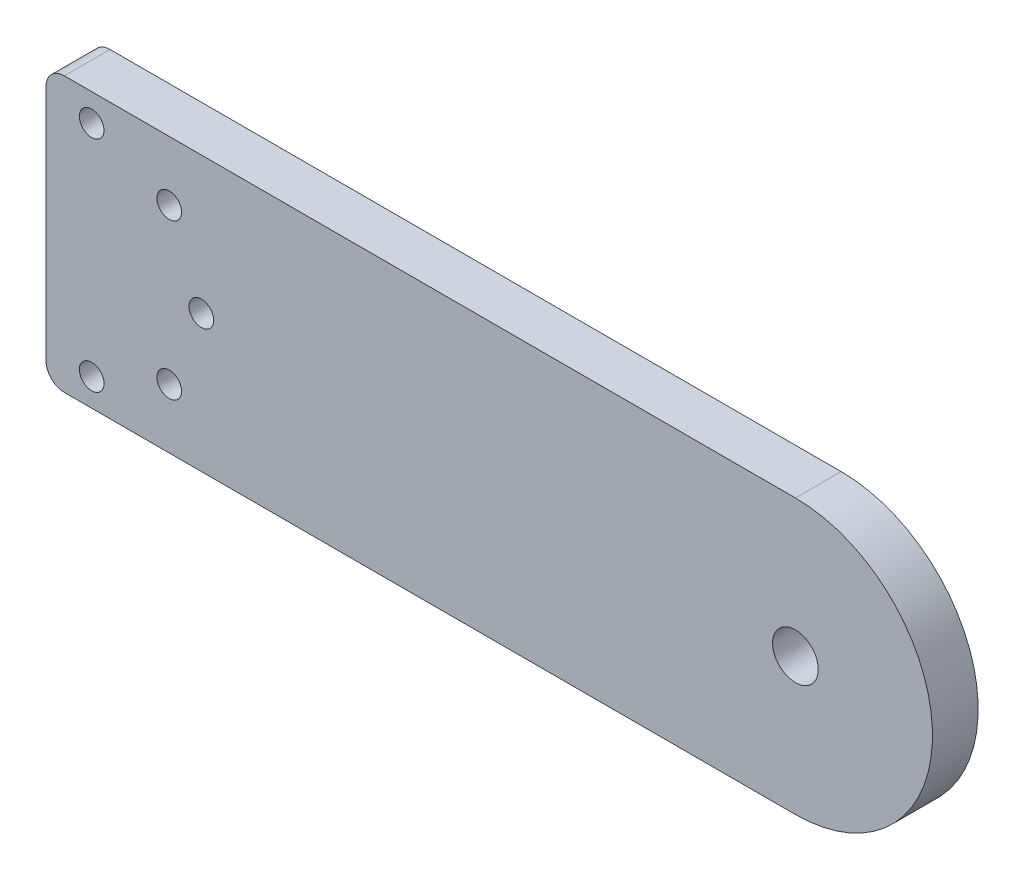
ISO-10303-21;
HEADER;
FILE_DESCRIPTION(('STEP AP214'),'2;1');
FILE_NAME('part.step','',(''),(''),'','','');
FILE_SCHEMA(('AUTOMOTIVE_DESIGN { 1 0 10303 214 1 1 1 1 }'));
ENDSEC;
DATA;
#1=APPLICATION_CONTEXT('core data for automotive mechanical design processes');
#2=APPLICATION_PROTOCOL_DEFINITION('international standard','automotive_design',2000,#1);
#3=PRODUCT_CONTEXT('',#1,'mechanical');
#4=PRODUCT('Part','Part','',(#3));
#5=PRODUCT_RELATED_PRODUCT_CATEGORY('part','',(#4));
#6=PRODUCT_DEFINITION_FORMATION('','',#4);
#7=PRODUCT_DEFINITION_CONTEXT('part definition',#1,'design');
#8=PRODUCT_DEFINITION('design','',#6,#7);
#9=PRODUCT_DEFINITION_SHAPE('','',#8);
#10=(LENGTH_UNIT() NAMED_UNIT(*) SI_UNIT(.MILLI.,.METRE.));
#11=(NAMED_UNIT(*) PLANE_ANGLE_UNIT() SI_UNIT($,.RADIAN.));
#12=(NAMED_UNIT(*) SI_UNIT($,.STERADIAN.) SOLID_ANGLE_UNIT());
#13=UNCERTAINTY_MEASURE_WITH_UNIT(LENGTH_MEASURE(1.E-05),#10,'distance_accuracy_value','');
#14=(GEOMETRIC_REPRESENTATION_CONTEXT(3) GLOBAL_UNCERTAINTY_ASSIGNED_CONTEXT((#13)) GLOBAL_UNIT_ASSIGNED_CONTEXT((#10,
#11,#12)) REPRESENTATION_CONTEXT('',''));
#15=CARTESIAN_POINT('',(0.,0.,0.));
#16=DIRECTION('',(0.,0.,1.));
#17=DIRECTION('',(1.,0.,0.));
#18=AXIS2_PLACEMENT_3D('',#15,#16,#17);
#19=CARTESIAN_POINT('',(-38.,-13.,5.));
#20=DIRECTION('',(0.,0.,1.));
#21=DIRECTION('',(1.,0.,0.));
#22=AXIS2_PLACEMENT_3D('',#19,#20,#21);
#23=PLANE('',#22);
#24=CARTESIAN_POINT('',(-23.,0.,5.));
#25=DIRECTION('',(0.,0.,1.));
#26=DIRECTION('',(1.,0.,0.));
#27=AXIS2_PLACEMENT_3D('',#24,#25,#26);
#28=CIRCLE('',#27,1.35);
#29=CARTESIAN_POINT('',(-21.65,0.,5.));
#30=VERTEX_POINT('',#29);
#31=EDGE_CURVE('E205',#30,#30,#28,.T.);
#32=ORIENTED_EDGE('',*,*,#31,.F.);
#33=EDGE_LOOP('',(#32));
#34=FACE_BOUND('',#33,.T.);
#35=CARTESIAN_POINT('',(-35.,12.,5.));
#36=DIRECTION('',(0.,0.,1.));
#37=DIRECTION('',(1.,0.,0.));
#38=AXIS2_PLACEMENT_3D('',#35,#36,#37);
#39=CIRCLE('',#38,1.35);
#40=CARTESIAN_POINT('',(-33.65,12.,5.));
#41=VERTEX_POINT('',#40);
#42=EDGE_CURVE('E217',#41,#41,#39,.T.);
#43=ORIENTED_EDGE('',*,*,#42,.F.);
#44=EDGE_LOOP('',(#43));
#45=FACE_BOUND('',#44,.T.);
#46=CARTESIAN_POINT('',(-35.,-12.,5.));
#47=DIRECTION('',(0.,0.,1.));
#48=DIRECTION('',(1.,0.,0.));
#49=AXIS2_PLACEMENT_3D('',#46,#47,#48);
#50=CIRCLE('',#49,1.35);
#51=CARTESIAN_POINT('',(-33.65,-12.,5.));
#52=VERTEX_POINT('',#51);
#53=EDGE_CURVE('E130',#52,#52,#50,.T.);
#54=ORIENTED_EDGE('',*,*,#53,.F.);
#55=EDGE_LOOP('',(#54));
#56=FACE_BOUND('',#55,.T.);
#57=CARTESIAN_POINT('',(-38.,-13.,5.));
#58=DIRECTION('',(0.,0.,1.));
#59=DIRECTION('',(1.,0.,0.));
#60=AXIS2_PLACEMENT_3D('',#57,#58,#59);
#61=CIRCLE('',#60,2.);
#62=CARTESIAN_POINT('',(-40.,-13.,5.));
#63=VERTEX_POINT('',#62);
#64=CARTESIAN_POINT('',(-38.,-15.,5.));
#65=VERTEX_POINT('',#64);
#66=EDGE_CURVE('E137',#63,#65,#61,.T.);
#67=ORIENTED_EDGE('',*,*,#66,.T.);
#68=DIRECTION('',(1.,0.,0.));
#69=VECTOR('',#68,1.);
#70=CARTESIAN_POINT('',(42.,-15.,5.));
#71=LINE('',#70,#69);
#72=CARTESIAN_POINT('',(42.,-15.,5.));
#73=VERTEX_POINT('',#72);
#74=EDGE_CURVE('E95',#65,#73,#71,.T.);
#75=ORIENTED_EDGE('',*,*,#74,.T.);
#76=CARTESIAN_POINT('',(42.,0.,5.));
#77=DIRECTION('',(0.,0.,1.));
#78=DIRECTION('',(-1.,0.,0.));
#79=AXIS2_PLACEMENT_3D('',#76,#77,#78);
#80=CIRCLE('',#79,15.);
#81=CARTESIAN_POINT('',(42.,15.,5.));
#82=VERTEX_POINT('',#81);
#83=EDGE_CURVE('E108',#73,#82,#80,.T.);
#84=ORIENTED_EDGE('',*,*,#83,.T.);
#85=DIRECTION('',(-1.,0.,0.));
#86=VECTOR('',#85,1.);
#87=CARTESIAN_POINT('',(42.,15.,5.));
#88=LINE('',#87,#86);
#89=CARTESIAN_POINT('',(-38.,15.,5.));
#90=VERTEX_POINT('',#89);
#91=EDGE_CURVE('E102',#82,#90,#88,.T.);
#92=ORIENTED_EDGE('',*,*,#91,.T.);
#93=CARTESIAN_POINT('',(-38.,13.,5.));
#94=DIRECTION('',(0.,0.,1.));
#95=DIRECTION('',(1.,0.,0.));
#96=AXIS2_PLACEMENT_3D('',#93,#94,#95);
#97=CIRCLE('',#96,2.00000000000001);
#98=CARTESIAN_POINT('',(-40.,13.,5.));
#99=VERTEX_POINT('',#98);
#100=EDGE_CURVE('E106',#90,#99,#97,.T.);
#101=ORIENTED_EDGE('',*,*,#100,.T.);
#102=DIRECTION('',(0.,-1.,0.));
#103=VECTOR('',#102,1.);
#104=CARTESIAN_POINT('',(-40.,13.,5.));
#105=LINE('',#104,#103);
#106=EDGE_CURVE('E58',#99,#63,#105,.T.);
#107=ORIENTED_EDGE('',*,*,#106,.T.);
#108=EDGE_LOOP('',(#67,#75,#84,#92,#101,#107));
#109=FACE_BOUND('',#108,.T.);
#110=CARTESIAN_POINT('',(-26.5147186257614,-8.48528137423857,5.));
#111=DIRECTION('',(0.,0.,1.));
#112=DIRECTION('',(1.,0.,0.));
#113=AXIS2_PLACEMENT_3D('',#110,#111,#112);
#114=CIRCLE('',#113,1.35);
#115=CARTESIAN_POINT('',(-25.1647186257614,-8.48528137423857,5.));
#116=VERTEX_POINT('',#115);
#117=EDGE_CURVE('E223',#116,#116,#114,.T.);
#118=ORIENTED_EDGE('',*,*,#117,.F.);
#119=EDGE_LOOP('',(#118));
#120=FACE_BOUND('',#119,.T.);
#121=CARTESIAN_POINT('',(-26.5147186257614,8.48528137423858,5.));
#122=DIRECTION('',(0.,0.,1.));
#123=DIRECTION('',(1.,0.,0.));
#124=AXIS2_PLACEMENT_3D('',#121,#122,#123);
#125=CIRCLE('',#124,1.35);
#126=CARTESIAN_POINT('',(-25.1647186257614,8.48528137423858,5.));
#127=VERTEX_POINT('',#126);
#128=EDGE_CURVE('E211',#127,#127,#125,.T.);
#129=ORIENTED_EDGE('',*,*,#128,.F.);
#130=EDGE_LOOP('',(#129));
#131=FACE_BOUND('',#130,.T.);
#132=CARTESIAN_POINT('',(42.,0.,5.));
#133=DIRECTION('',(0.,0.,1.));
#134=DIRECTION('',(1.,0.,0.));
#135=AXIS2_PLACEMENT_3D('',#132,#133,#134);
#136=CIRCLE('',#135,2.5);
#137=CARTESIAN_POINT('',(44.5,0.,5.));
#138=VERTEX_POINT('',#137);
#139=EDGE_CURVE('E196',#138,#138,#136,.T.);
#140=ORIENTED_EDGE('',*,*,#139,.F.);
#141=EDGE_LOOP('',(#140));
#142=FACE_BOUND('',#141,.T.);
#143=ADVANCED_FACE('F41',(#34,#45,#56,#109,#120,#131,#142),#23,.T.);
#144=CARTESIAN_POINT('',(-38.,-13.,0.));
#145=DIRECTION('',(0.,0.,1.));
#146=DIRECTION('',(1.,0.,0.));
#147=AXIS2_PLACEMENT_3D('',#144,#145,#146);
#148=PLANE('',#147);
#149=CARTESIAN_POINT('',(-38.,-13.,0.));
#150=DIRECTION('',(0.,0.,1.));
#151=DIRECTION('',(1.,0.,0.));
#152=AXIS2_PLACEMENT_3D('',#149,#150,#151);
#153=CIRCLE('',#152,2.);
#154=CARTESIAN_POINT('',(-40.,-13.,0.));
#155=VERTEX_POINT('',#154);
#156=CARTESIAN_POINT('',(-38.,-15.,0.));
#157=VERTEX_POINT('',#156);
#158=EDGE_CURVE('E126',#155,#157,#153,.T.);
#159=ORIENTED_EDGE('',*,*,#158,.F.);
#160=DIRECTION('',(0.,-1.,0.));
#161=VECTOR('',#160,1.);
#162=CARTESIAN_POINT('',(-40.,13.,0.));
#163=LINE('',#162,#161);
#164=CARTESIAN_POINT('',(-40.,13.,0.));
#165=VERTEX_POINT('',#164);
#166=EDGE_CURVE('E87',#165,#155,#163,.T.);
#167=ORIENTED_EDGE('',*,*,#166,.F.);
#168=CARTESIAN_POINT('',(-38.,13.,0.));
#169=DIRECTION('',(0.,0.,1.));
#170=DIRECTION('',(1.,0.,0.));
#171=AXIS2_PLACEMENT_3D('',#168,#169,#170);
#172=CIRCLE('',#171,2.00000000000001);
#173=CARTESIAN_POINT('',(-38.,15.,0.));
#174=VERTEX_POINT('',#173);
#175=EDGE_CURVE('E81',#174,#165,#172,.T.);
#176=ORIENTED_EDGE('',*,*,#175,.F.);
#177=DIRECTION('',(-1.,0.,0.));
#178=VECTOR('',#177,1.);
#179=CARTESIAN_POINT('',(42.,15.,0.));
#180=LINE('',#179,#178);
#181=CARTESIAN_POINT('',(42.,15.,0.));
#182=VERTEX_POINT('',#181);
#183=EDGE_CURVE('E116',#182,#174,#180,.T.);
#184=ORIENTED_EDGE('',*,*,#183,.F.);
#185=CARTESIAN_POINT('',(42.,0.,0.));
#186=DIRECTION('',(0.,0.,1.));
#187=DIRECTION('',(-1.,0.,0.));
#188=AXIS2_PLACEMENT_3D('',#185,#186,#187);
#189=CIRCLE('',#188,15.);
#190=CARTESIAN_POINT('',(42.,-15.,0.));
#191=VERTEX_POINT('',#190);
#192=EDGE_CURVE('E132',#191,#182,#189,.T.);
#193=ORIENTED_EDGE('',*,*,#192,.F.);
#194=DIRECTION('',(1.,0.,0.));
#195=VECTOR('',#194,1.);
#196=CARTESIAN_POINT('',(42.,-15.,0.));
#197=LINE('',#196,#195);
#198=EDGE_CURVE('E129',#157,#191,#197,.T.);
#199=ORIENTED_EDGE('',*,*,#198,.F.);
#200=EDGE_LOOP('',(#159,#167,#176,#184,#193,#199));
#201=FACE_BOUND('',#200,.T.);
#202=CARTESIAN_POINT('',(-35.,-12.,0.));
#203=DIRECTION('',(0.,0.,1.));
#204=DIRECTION('',(1.,0.,0.));
#205=AXIS2_PLACEMENT_3D('',#202,#203,#204);
#206=CIRCLE('',#205,1.35);
#207=CARTESIAN_POINT('',(-33.65,-12.,0.));
#208=VERTEX_POINT('',#207);
#209=EDGE_CURVE('E226',#208,#208,#206,.T.);
#210=ORIENTED_EDGE('',*,*,#209,.T.);
#211=EDGE_LOOP('',(#210));
#212=FACE_BOUND('',#211,.T.);
#213=CARTESIAN_POINT('',(-26.5147186257614,-8.48528137423857,0.));
#214=DIRECTION('',(0.,0.,1.));
#215=DIRECTION('',(1.,0.,0.));
#216=AXIS2_PLACEMENT_3D('',#213,#214,#215);
#217=CIRCLE('',#216,1.35);
#218=CARTESIAN_POINT('',(-25.1647186257614,-8.48528137423857,0.));
#219=VERTEX_POINT('',#218);
#220=EDGE_CURVE('E220',#219,#219,#217,.T.);
#221=ORIENTED_EDGE('',*,*,#220,.T.);
#222=EDGE_LOOP('',(#221));
#223=FACE_BOUND('',#222,.T.);
#224=CARTESIAN_POINT('',(-35.,12.,0.));
#225=DIRECTION('',(0.,0.,1.));
#226=DIRECTION('',(1.,0.,0.));
#227=AXIS2_PLACEMENT_3D('',#224,#225,#226);
#228=CIRCLE('',#227,1.35);
#229=CARTESIAN_POINT('',(-33.65,12.,0.));
#230=VERTEX_POINT('',#229);
#231=EDGE_CURVE('E214',#230,#230,#228,.T.);
#232=ORIENTED_EDGE('',*,*,#231,.T.);
#233=EDGE_LOOP('',(#232));
#234=FACE_BOUND('',#233,.T.);
#235=CARTESIAN_POINT('',(-26.5147186257614,8.48528137423858,0.));
#236=DIRECTION('',(0.,0.,1.));
#237=DIRECTION('',(1.,0.,0.));
#238=AXIS2_PLACEMENT_3D('',#235,#236,#237);
#239=CIRCLE('',#238,1.35);
#240=CARTESIAN_POINT('',(-25.1647186257614,8.48528137423858,0.));
#241=VERTEX_POINT('',#240);
#242=EDGE_CURVE('E208',#241,#241,#239,.T.);
#243=ORIENTED_EDGE('',*,*,#242,.T.);
#244=EDGE_LOOP('',(#243));
#245=FACE_BOUND('',#244,.T.);
#246=CARTESIAN_POINT('',(-23.,0.,0.));
#247=DIRECTION('',(0.,0.,1.));
#248=DIRECTION('',(1.,0.,0.));
#249=AXIS2_PLACEMENT_3D('',#246,#247,#248);
#250=CIRCLE('',#249,1.35);
#251=CARTESIAN_POINT('',(-21.65,0.,0.));
#252=VERTEX_POINT('',#251);
#253=EDGE_CURVE('E202',#252,#252,#250,.T.);
#254=ORIENTED_EDGE('',*,*,#253,.T.);
#255=EDGE_LOOP('',(#254));
#256=FACE_BOUND('',#255,.T.);
#257=CARTESIAN_POINT('',(42.,0.,0.));
#258=DIRECTION('',(0.,0.,1.));
#259=DIRECTION('',(1.,0.,0.));
#260=AXIS2_PLACEMENT_3D('',#257,#258,#259);
#261=CIRCLE('',#260,2.5);
#262=CARTESIAN_POINT('',(44.5,0.,0.));
#263=VERTEX_POINT('',#262);
#264=EDGE_CURVE('E199',#263,#263,#261,.T.);
#265=ORIENTED_EDGE('',*,*,#264,.T.);
#266=EDGE_LOOP('',(#265));
#267=FACE_BOUND('',#266,.T.);
#268=ADVANCED_FACE('F146',(#201,#212,#223,#234,#245,#256,#267),#148,.F.);
#269=CARTESIAN_POINT('',(-38.,-13.,5.));
#270=DIRECTION('',(0.,0.,-1.));
#271=DIRECTION('',(-1.,0.,0.));
#272=AXIS2_PLACEMENT_3D('',#269,#270,#271);
#273=CYLINDRICAL_SURFACE('',#272,2.);
#274=ORIENTED_EDGE('',*,*,#158,.T.);
#275=DIRECTION('',(0.,0.,-1.));
#276=VECTOR('',#275,1.);
#277=CARTESIAN_POINT('',(-38.,-15.,5.));
#278=LINE('',#277,#276);
#279=EDGE_CURVE('E11',#65,#157,#278,.T.);
#280=ORIENTED_EDGE('',*,*,#279,.F.);
#281=ORIENTED_EDGE('',*,*,#66,.F.);
#282=DIRECTION('',(0.,0.,-1.));
#283=VECTOR('',#282,1.);
#284=CARTESIAN_POINT('',(-40.,-13.,5.));
#285=LINE('',#284,#283);
#286=EDGE_CURVE('E122',#63,#155,#285,.T.);
#287=ORIENTED_EDGE('',*,*,#286,.T.);
#288=EDGE_LOOP('',(#274,#280,#281,#287));
#289=FACE_BOUND('',#288,.T.);
#290=ADVANCED_FACE('F43',(#289),#273,.T.);
#291=CARTESIAN_POINT('',(42.,-15.,5.));
#292=DIRECTION('',(0.,1.,0.));
#293=DIRECTION('',(-1.,0.,0.));
#294=AXIS2_PLACEMENT_3D('',#291,#292,#293);
#295=PLANE('',#294);
#296=ORIENTED_EDGE('',*,*,#198,.T.);
#297=DIRECTION('',(0.,0.,-1.));
#298=VECTOR('',#297,1.);
#299=CARTESIAN_POINT('',(42.,-15.,5.));
#300=LINE('',#299,#298);
#301=EDGE_CURVE('E50',#73,#191,#300,.T.);
#302=ORIENTED_EDGE('',*,*,#301,.F.);
#303=ORIENTED_EDGE('',*,*,#74,.F.);
#304=ORIENTED_EDGE('',*,*,#279,.T.);
#305=EDGE_LOOP('',(#296,#302,#303,#304));
#306=FACE_BOUND('',#305,.T.);
#307=ADVANCED_FACE('F308',(#306),#295,.F.);
#308=CARTESIAN_POINT('',(42.,0.,5.));
#309=DIRECTION('',(0.,0.,-1.));
#310=DIRECTION('',(-1.,0.,0.));
#311=AXIS2_PLACEMENT_3D('',#308,#309,#310);
#312=CYLINDRICAL_SURFACE('',#311,15.);
#313=ORIENTED_EDGE('',*,*,#192,.T.);
#314=DIRECTION('',(0.,0.,-1.));
#315=VECTOR('',#314,1.);
#316=CARTESIAN_POINT('',(42.,15.,5.));
#317=LINE('',#316,#315);
#318=EDGE_CURVE('E117',#82,#182,#317,.T.);
#319=ORIENTED_EDGE('',*,*,#318,.F.);
#320=ORIENTED_EDGE('',*,*,#83,.F.);
#321=ORIENTED_EDGE('',*,*,#301,.T.);
#322=EDGE_LOOP('',(#313,#319,#320,#321));
#323=FACE_BOUND('',#322,.T.);
#324=ADVANCED_FACE('F143',(#323),#312,.T.);
#325=CARTESIAN_POINT('',(42.,15.,5.));
#326=DIRECTION('',(0.,-1.,0.));
#327=DIRECTION('',(0.,0.,-1.));
#328=AXIS2_PLACEMENT_3D('',#325,#326,#327);
#329=PLANE('',#328);
#330=ORIENTED_EDGE('',*,*,#183,.T.);
#331=DIRECTION('',(0.,0.,-1.));
#332=VECTOR('',#331,1.);
#333=CARTESIAN_POINT('',(-38.,15.,5.));
#334=LINE('',#333,#332);
#335=EDGE_CURVE('E113',#90,#174,#334,.T.);
#336=ORIENTED_EDGE('',*,*,#335,.F.);
#337=ORIENTED_EDGE('',*,*,#91,.F.);
#338=ORIENTED_EDGE('',*,*,#318,.T.);
#339=EDGE_LOOP('',(#330,#336,#337,#338));
#340=FACE_BOUND('',#339,.T.);
#341=ADVANCED_FACE('F114',(#340),#329,.F.);
#342=CARTESIAN_POINT('',(-38.,13.,5.));
#343=DIRECTION('',(0.,0.,-1.));
#344=DIRECTION('',(-1.,0.,0.));
#345=AXIS2_PLACEMENT_3D('',#342,#343,#344);
#346=CYLINDRICAL_SURFACE('',#345,2.00000000000001);
#347=ORIENTED_EDGE('',*,*,#175,.T.);
#348=DIRECTION('',(0.,0.,-1.));
#349=VECTOR('',#348,1.);
#350=CARTESIAN_POINT('',(-40.,13.,5.));
#351=LINE('',#350,#349);
#352=EDGE_CURVE('E118',#99,#165,#351,.T.);
#353=ORIENTED_EDGE('',*,*,#352,.F.);
#354=ORIENTED_EDGE('',*,*,#100,.F.);
#355=ORIENTED_EDGE('',*,*,#335,.T.);
#356=EDGE_LOOP('',(#347,#353,#354,#355));
#357=FACE_BOUND('',#356,.T.);
#358=ADVANCED_FACE('F120',(#357),#346,.T.);
#359=CARTESIAN_POINT('',(-40.,13.,5.));
#360=DIRECTION('',(1.,0.,0.));
#361=DIRECTION('',(0.,0.,-1.));
#362=AXIS2_PLACEMENT_3D('',#359,#360,#361);
#363=PLANE('',#362);
#364=ORIENTED_EDGE('',*,*,#166,.T.);
#365=ORIENTED_EDGE('',*,*,#286,.F.);
#366=ORIENTED_EDGE('',*,*,#106,.F.);
#367=ORIENTED_EDGE('',*,*,#352,.T.);
#368=EDGE_LOOP('',(#364,#365,#366,#367));
#369=FACE_BOUND('',#368,.T.);
#370=ADVANCED_FACE('F151',(#369),#363,.F.);
#371=CARTESIAN_POINT('',(-35.,-12.,5.));
#372=DIRECTION('',(0.,0.,-1.));
#373=DIRECTION('',(-1.,0.,0.));
#374=AXIS2_PLACEMENT_3D('',#371,#372,#373);
#375=CYLINDRICAL_SURFACE('',#374,1.35);
#376=ORIENTED_EDGE('',*,*,#53,.T.);
#377=EDGE_LOOP('',(#376));
#378=FACE_BOUND('',#377,.T.);
#379=ORIENTED_EDGE('',*,*,#209,.F.);
#380=EDGE_LOOP('',(#379));
#381=FACE_BOUND('',#380,.T.);
#382=ADVANCED_FACE('F153',(#378,#381),#375,.F.);
#383=CARTESIAN_POINT('',(-26.5147186257614,-8.48528137423857,5.));
#384=DIRECTION('',(0.,0.,-1.));
#385=DIRECTION('',(-1.,0.,0.));
#386=AXIS2_PLACEMENT_3D('',#383,#384,#385);
#387=CYLINDRICAL_SURFACE('',#386,1.35);
#388=ORIENTED_EDGE('',*,*,#117,.T.);
#389=EDGE_LOOP('',(#388));
#390=FACE_BOUND('',#389,.T.);
#391=ORIENTED_EDGE('',*,*,#220,.F.);
#392=EDGE_LOOP('',(#391));
#393=FACE_BOUND('',#392,.T.);
#394=ADVANCED_FACE('F159',(#390,#393),#387,.F.);
#395=CARTESIAN_POINT('',(-35.,12.,5.));
#396=DIRECTION('',(0.,0.,-1.));
#397=DIRECTION('',(-1.,0.,0.));
#398=AXIS2_PLACEMENT_3D('',#395,#396,#397);
#399=CYLINDRICAL_SURFACE('',#398,1.35);
#400=ORIENTED_EDGE('',*,*,#42,.T.);
#401=EDGE_LOOP('',(#400));
#402=FACE_BOUND('',#401,.T.);
#403=ORIENTED_EDGE('',*,*,#231,.F.);
#404=EDGE_LOOP('',(#403));
#405=FACE_BOUND('',#404,.T.);
#406=ADVANCED_FACE('F175',(#402,#405),#399,.F.);
#407=CARTESIAN_POINT('',(-26.5147186257614,8.48528137423858,5.));
#408=DIRECTION('',(0.,0.,-1.));
#409=DIRECTION('',(-1.,0.,0.));
#410=AXIS2_PLACEMENT_3D('',#407,#408,#409);
#411=CYLINDRICAL_SURFACE('',#410,1.35);
#412=ORIENTED_EDGE('',*,*,#128,.T.);
#413=EDGE_LOOP('',(#412));
#414=FACE_BOUND('',#413,.T.);
#415=ORIENTED_EDGE('',*,*,#242,.F.);
#416=EDGE_LOOP('',(#415));
#417=FACE_BOUND('',#416,.T.);
#418=ADVANCED_FACE('F179',(#414,#417),#411,.F.);
#419=CARTESIAN_POINT('',(-23.,0.,5.));
#420=DIRECTION('',(0.,0.,-1.));
#421=DIRECTION('',(-1.,0.,0.));
#422=AXIS2_PLACEMENT_3D('',#419,#420,#421);
#423=CYLINDRICAL_SURFACE('',#422,1.35);
#424=ORIENTED_EDGE('',*,*,#31,.T.);
#425=EDGE_LOOP('',(#424));
#426=FACE_BOUND('',#425,.T.);
#427=ORIENTED_EDGE('',*,*,#253,.F.);
#428=EDGE_LOOP('',(#427));
#429=FACE_BOUND('',#428,.T.);
#430=ADVANCED_FACE('F183',(#426,#429),#423,.F.);
#431=CARTESIAN_POINT('',(42.,0.,5.));
#432=DIRECTION('',(0.,0.,-1.));
#433=DIRECTION('',(-1.,0.,0.));
#434=AXIS2_PLACEMENT_3D('',#431,#432,#433);
#435=CYLINDRICAL_SURFACE('',#434,2.5);
#436=ORIENTED_EDGE('',*,*,#139,.T.);
#437=EDGE_LOOP('',(#436));
#438=FACE_BOUND('',#437,.T.);
#439=ORIENTED_EDGE('',*,*,#264,.F.);
#440=EDGE_LOOP('',(#439));
#441=FACE_BOUND('',#440,.T.);
#442=ADVANCED_FACE('F187',(#438,#441),#435,.F.);
#443=CLOSED_SHELL('',(#143,#268,#290,#307,#324,#341,#358,#370,#382,#394,#406,#418,#430,#442));
#444=MANIFOLD_SOLID_BREP('B2',#443);
#445=ADVANCED_BREP_SHAPE_REPRESENTATION('',(#18,#444),#14);
#446=SHAPE_DEFINITION_REPRESENTATION(#9,#445);
ENDSEC;
END-ISO-10303-21;
